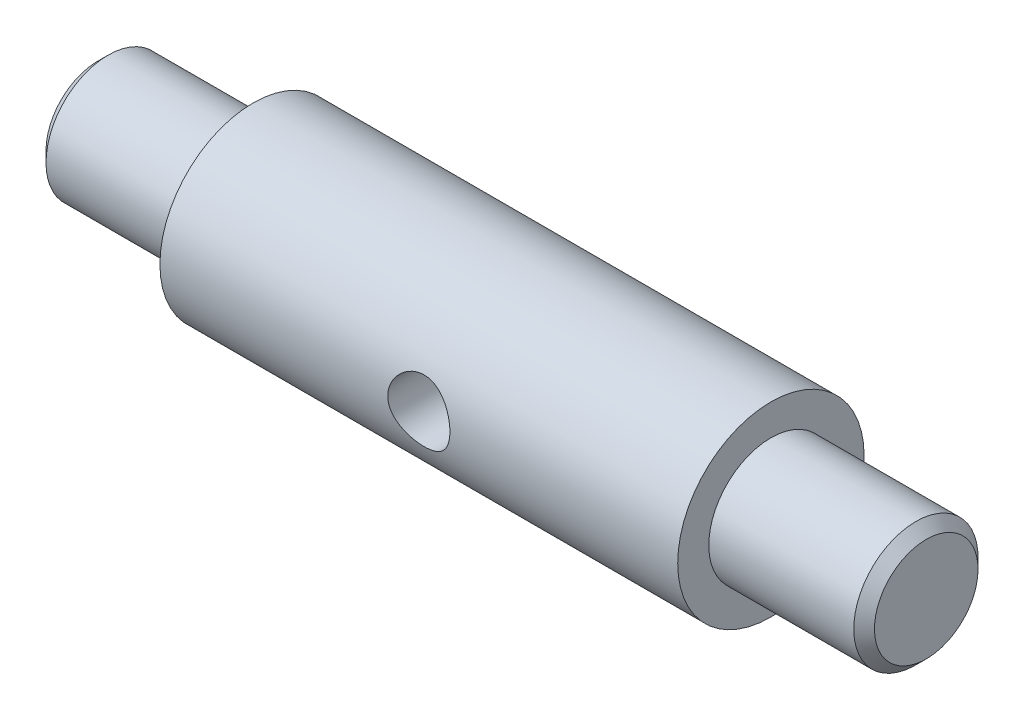
ISO-10303-21;
HEADER;
FILE_DESCRIPTION(('STEP AP214'),'2;1');
FILE_NAME('part.step','',(''),(''),'','','');
FILE_SCHEMA(('AUTOMOTIVE_DESIGN { 1 0 10303 214 1 1 1 1 }'));
ENDSEC;
DATA;
#1=APPLICATION_CONTEXT('core data for automotive mechanical design processes');
#2=APPLICATION_PROTOCOL_DEFINITION('international standard','automotive_design',2000,#1);
#3=PRODUCT_CONTEXT('',#1,'mechanical');
#4=PRODUCT('Part','Part','',(#3));
#5=PRODUCT_RELATED_PRODUCT_CATEGORY('part','',(#4));
#6=PRODUCT_DEFINITION_FORMATION('','',#4);
#7=PRODUCT_DEFINITION_CONTEXT('part definition',#1,'design');
#8=PRODUCT_DEFINITION('design','',#6,#7);
#9=PRODUCT_DEFINITION_SHAPE('','',#8);
#10=(LENGTH_UNIT() NAMED_UNIT(*) SI_UNIT(.MILLI.,.METRE.));
#11=(NAMED_UNIT(*) PLANE_ANGLE_UNIT() SI_UNIT($,.RADIAN.));
#12=(NAMED_UNIT(*) SI_UNIT($,.STERADIAN.) SOLID_ANGLE_UNIT());
#13=UNCERTAINTY_MEASURE_WITH_UNIT(LENGTH_MEASURE(1.E-05),#10,'distance_accuracy_value','');
#14=(GEOMETRIC_REPRESENTATION_CONTEXT(3) GLOBAL_UNCERTAINTY_ASSIGNED_CONTEXT((#13)) GLOBAL_UNIT_ASSIGNED_CONTEXT((#10,
#11,#12)) REPRESENTATION_CONTEXT('',''));
#15=CARTESIAN_POINT('',(0.,0.,0.));
#16=DIRECTION('',(0.,0.,1.));
#17=DIRECTION('',(1.,0.,0.));
#18=AXIS2_PLACEMENT_3D('',#15,#16,#17);
#19=CARTESIAN_POINT('',(40.,0.,-25.));
#20=DIRECTION('',(0.,0.,1.));
#21=DIRECTION('',(1.,0.,0.));
#22=AXIS2_PLACEMENT_3D('',#19,#20,#21);
#23=CYLINDRICAL_SURFACE('',#22,3.);
#24=CARTESIAN_POINT('',(43.,0.,8.99999999999999));
#25=CARTESIAN_POINT('',(43.0000007611949,0.16369008866017,9.00000045902831));
#26=CARTESIAN_POINT('',(42.9865592016184,0.32737558361565,8.99549308522634));
#27=CARTESIAN_POINT('',(42.9333126735484,0.649925282618917,8.97795630609841));
#28=CARTESIAN_POINT('',(42.8935049681532,0.808788984356453,8.96492601606457));
#29=CARTESIAN_POINT('',(42.7890422698479,1.11699836850533,8.93175923719327));
#30=CARTESIAN_POINT('',(42.7244288126222,1.2663594776581,8.91163463192559));
#31=CARTESIAN_POINT('',(42.572376481485,1.55212481041597,8.86633337152024));
#32=CARTESIAN_POINT('',(42.4849331049922,1.68852647087612,8.84115572003333));
#33=CARTESIAN_POINT('',(42.2865225854237,1.9492250250668,8.78742283329014));
#34=CARTESIAN_POINT('',(42.1749062972185,2.07301110089493,8.75878669391354));
#35=CARTESIAN_POINT('',(41.9326985358803,2.30049807810625,8.70180944349364));
#36=CARTESIAN_POINT('',(41.8021028952145,2.40419455646839,8.67346839871646));
#37=CARTESIAN_POINT('',(41.5210446544106,2.59147482668358,8.61939997431821));
#38=CARTESIAN_POINT('',(41.3701187808036,2.67439457466309,8.59377117827064));
#39=CARTESIAN_POINT('',(41.0554717166244,2.81345662163316,8.54925916255803));
#40=CARTESIAN_POINT('',(40.8917544485118,2.8696070921603,8.53037388482236));
#41=CARTESIAN_POINT('',(40.5619803355099,2.95162038452749,8.50233909808131));
#42=CARTESIAN_POINT('',(40.3961883745328,2.97844034481531,8.49288287308833));
#43=CARTESIAN_POINT('',(40.0622087375324,3.00402337000343,8.48386969888522));
#44=CARTESIAN_POINT('',(39.8940218178724,3.00279510481416,8.48430969068189));
#45=CARTESIAN_POINT('',(39.5681901086679,2.97305971111026,8.4947704502454));
#46=CARTESIAN_POINT('',(39.4104147912429,2.94580173950099,8.50435247602598));
#47=CARTESIAN_POINT('',(39.1018197411795,2.86681848854825,8.53129973173652));
#48=CARTESIAN_POINT('',(38.9510008436948,2.81509027977562,8.54866589352322));
#49=CARTESIAN_POINT('',(38.6577617512256,2.68781717418063,8.58953733393745));
#50=CARTESIAN_POINT('',(38.5155159235914,2.61190214612179,8.61313697379351));
#51=CARTESIAN_POINT('',(38.2453872751608,2.43866731890942,8.66377675727179));
#52=CARTESIAN_POINT('',(38.1175086191999,2.34134133709202,8.6908178937139));
#53=CARTESIAN_POINT('',(37.8727252055177,2.12204799804671,8.74701987503222));
#54=CARTESIAN_POINT('',(37.7567419164728,1.99905945022894,8.77621768064528));
#55=CARTESIAN_POINT('',(37.5468062000098,1.73501870991019,8.83220815161109));
#56=CARTESIAN_POINT('',(37.4528558855065,1.59396478698245,8.85900058614201));
#57=CARTESIAN_POINT('',(37.2889110992948,1.29584283913881,8.9075132381338));
#58=CARTESIAN_POINT('',(37.2191635259778,1.13862982924901,8.92918050024117));
#59=CARTESIAN_POINT('',(37.1073904781329,0.813807250093527,8.96461701433304));
#60=CARTESIAN_POINT('',(37.0653553737297,0.646201314464866,8.97838900964637));
#61=CARTESIAN_POINT('',(37.0118330019329,0.313151488587917,8.9960288121432));
#62=CARTESIAN_POINT('',(36.9991005724817,0.147928799594542,9.00030005501183));
#63=CARTESIAN_POINT('',(37.0009980207954,-0.18232520988071,8.99966708084481));
#64=CARTESIAN_POINT('',(37.0156232799396,-0.34735655795895,8.99476441258086));
#65=CARTESIAN_POINT('',(37.0708357232079,-0.667559598912767,8.97660074151312));
#66=CARTESIAN_POINT('',(37.1106586181485,-0.822878420504531,8.96358596133576));
#67=CARTESIAN_POINT('',(37.2141803334002,-1.12456787573872,8.93075540490209));
#68=CARTESIAN_POINT('',(37.2778821984034,-1.27093736552582,8.91093876140024));
#69=CARTESIAN_POINT('',(37.4292112955224,-1.55486488917982,8.86586793861868));
#70=CARTESIAN_POINT('',(37.5174237798495,-1.69208987765144,8.84048444267357));
#71=CARTESIAN_POINT('',(37.7145824500404,-1.95019449040676,8.78715761748787));
#72=CARTESIAN_POINT('',(37.8235349680953,-2.07106910338673,8.75921350781482));
#73=CARTESIAN_POINT('',(38.0649362530198,-2.2987575234189,8.70230543941333));
#74=CARTESIAN_POINT('',(38.1982276807806,-2.40468290773731,8.67335283262283));
#75=CARTESIAN_POINT('',(38.4813147034327,-2.59277256697072,8.61899919884125));
#76=CARTESIAN_POINT('',(38.6311104359022,-2.67493664379304,8.59359820146006));
#77=CARTESIAN_POINT('',(38.9430190458697,-2.81279079124909,8.5494717537415));
#78=CARTESIAN_POINT('',(39.1051062375063,-2.86853439649506,8.53073282378936));
#79=CARTESIAN_POINT('',(39.4371359501324,-2.95168400027807,8.50232496919348));
#80=CARTESIAN_POINT('',(39.607074896213,-2.97910276486182,8.49265195870917));
#81=CARTESIAN_POINT('',(39.9405912881227,-3.00382884743203,8.48393576622531));
#82=CARTESIAN_POINT('',(40.1040470208605,-3.0026107719252,8.48437200772245));
#83=CARTESIAN_POINT('',(40.4282952247662,-2.97372688034608,8.49453809471601));
#84=CARTESIAN_POINT('',(40.5890878538653,-2.94606263837576,8.50426738708084));
#85=CARTESIAN_POINT('',(40.9004069890074,-2.86611543938804,8.53153572914674));
#86=CARTESIAN_POINT('',(41.0510704750135,-2.81431003804654,8.54892294067432));
#87=CARTESIAN_POINT('',(41.3416822208148,-2.68793809727924,8.58949196455405));
#88=CARTESIAN_POINT('',(41.481628093564,-2.61336650566142,8.61267506290178));
#89=CARTESIAN_POINT('',(41.7534510097687,-2.43978207775029,8.66348487678138));
#90=CARTESIAN_POINT('',(41.8847095056952,-2.33984472829374,8.6912613492641));
#91=CARTESIAN_POINT('',(42.1290694401526,-2.11992864940694,8.74750068849758));
#92=CARTESIAN_POINT('',(42.2421657270642,-1.99994425335444,8.77596374737116));
#93=CARTESIAN_POINT('',(42.4514332368675,-1.73772467076206,8.83170091576632));
#94=CARTESIAN_POINT('',(42.546773043253,-1.59480454049919,8.85888545403769));
#95=CARTESIAN_POINT('',(42.7119712865519,-1.29407207221988,8.90777973517835));
#96=CARTESIAN_POINT('',(42.7818362377661,-1.13626355439705,8.92949087723789));
#97=CARTESIAN_POINT('',(42.891164897466,-0.817480941602932,8.96416545205625));
#98=CARTESIAN_POINT('',(42.9318473987901,-0.656963273029229,8.97747637267567));
#99=CARTESIAN_POINT('',(42.9862608420314,-0.330961248030742,8.99539221192664));
#100=CARTESIAN_POINT('',(42.9999992304896,-0.16547827670624,8.99999953595714));
#101=CARTESIAN_POINT('',(43.,0.,8.99999999999999));
#102=B_SPLINE_CURVE_WITH_KNOTS('',3,(#24,#25,#26,#27,#28,#29,#30,#31,#32,#33,#34,#35,#36,#37,
#38,#39,#40,#41,#42,#43,#44,#45,#46,#47,#48,#49,#50,#51,#52,#53,#54,#55,#56,#57,#58,#59,#60,#61,
#62,#63,#64,#65,#66,#67,#68,#69,#70,#71,#72,#73,#74,#75,#76,#77,#78,#79,#80,#81,#82,#83,#84,#85,
#86,#87,#88,#89,#90,#91,#92,#93,#94,#95,#96,#97,#98,#99,#100,#101),.UNSPECIFIED.,.T.,.F.,(4,2,2,
2,2,2,2,2,2,2,2,2,2,2,2,2,2,2,2,2,2,2,2,2,2,2,2,2,2,2,2,2,2,2,2,2,2,2,4),(0.,0.490461318078033,
0.980973555802562,1.47066801861082,1.9604591333973,2.46554052848268,2.97073299862591,
3.49045154470411,4.010011340785,4.51205777225521,5.01394901962457,5.49290479653841,
5.97191792566446,6.45864513465392,6.94551307674622,7.45779917434101,7.97013437899855,
8.48755216951073,9.00479006631625,9.49960749525509,9.9943413949253,10.4747447393464,
10.9552093585231,11.4483119953121,11.9415654246567,12.4572306864226,12.9729002470499,
13.4875204148031,14.0019085411752,14.4898699819277,14.9778023805413,15.4564676124125,
15.9352391452793,16.4349020007541,16.9347063337134,17.453989825053,17.9731404345737,
18.4690967512144,18.9649159811442),.UNSPECIFIED.);
#103=CARTESIAN_POINT('',(43.,0.,8.99999999999999));
#104=VERTEX_POINT('',#103);
#105=EDGE_CURVE('E103',#104,#104,#102,.T.);
#106=ORIENTED_EDGE('',*,*,#105,.T.);
#107=EDGE_LOOP('',(#106));
#108=FACE_BOUND('',#107,.T.);
#109=CARTESIAN_POINT('',(40.,0.,0.));
#110=DIRECTION('',(0.707106781186547,0.,0.707106781186548));
#111=DIRECTION('',(-0.707106781186547,0.,0.707106781186548));
#112=AXIS2_PLACEMENT_3D('',#109,#110,#111);
#113=ELLIPSE('',#112,4.24264068711929,3.);
#114=CARTESIAN_POINT('',(40.,-3.,0.));
#115=VERTEX_POINT('',#114);
#116=CARTESIAN_POINT('',(40.,3.,0.));
#117=VERTEX_POINT('',#116);
#118=EDGE_CURVE('E56',#115,#117,#113,.F.);
#119=ORIENTED_EDGE('',*,*,#118,.T.);
#120=CARTESIAN_POINT('',(40.,0.,0.));
#121=DIRECTION('',(-0.707106781186547,0.,0.707106781186548));
#122=DIRECTION('',(0.707106781186547,0.,0.707106781186548));
#123=AXIS2_PLACEMENT_3D('',#120,#121,#122);
#124=ELLIPSE('',#123,4.24264068711929,3.);
#125=EDGE_CURVE('E11',#117,#115,#124,.F.);
#126=ORIENTED_EDGE('',*,*,#125,.T.);
#127=EDGE_LOOP('',(#119,#126));
#128=FACE_BOUND('',#127,.T.);
#129=ADVANCED_FACE('F41',(#108,#128),#23,.F.);
#130=CARTESIAN_POINT('',(0.,0.,0.));
#131=DIRECTION('',(-1.,0.,0.));
#132=DIRECTION('',(0.,-1.,0.));
#133=AXIS2_PLACEMENT_3D('',#130,#131,#132);
#134=PLANE('',#133);
#135=CARTESIAN_POINT('',(0.,0.,0.));
#136=DIRECTION('',(-1.,0.,0.));
#137=DIRECTION('',(0.,-1.,0.));
#138=AXIS2_PLACEMENT_3D('',#135,#136,#137);
#139=CIRCLE('',#138,3.);
#140=CARTESIAN_POINT('',(0.,-3.,0.));
#141=VERTEX_POINT('',#140);
#142=EDGE_CURVE('E152',#141,#141,#139,.T.);
#143=ORIENTED_EDGE('',*,*,#142,.F.);
#144=EDGE_LOOP('',(#143));
#145=FACE_BOUND('',#144,.T.);
#146=CARTESIAN_POINT('',(0.,0.,0.));
#147=DIRECTION('',(-1.,0.,0.));
#148=DIRECTION('',(0.,-1.,0.));
#149=AXIS2_PLACEMENT_3D('',#146,#147,#148);
#150=CIRCLE('',#149,5.);
#151=CARTESIAN_POINT('',(0.,-5.,0.));
#152=VERTEX_POINT('',#151);
#153=EDGE_CURVE('E84',#152,#152,#150,.T.);
#154=ORIENTED_EDGE('',*,*,#153,.T.);
#155=EDGE_LOOP('',(#154));
#156=FACE_BOUND('',#155,.T.);
#157=ADVANCED_FACE('F137',(#145,#156),#134,.T.);
#158=CARTESIAN_POINT('',(80.,0.,0.));
#159=DIRECTION('',(1.,0.,0.));
#160=DIRECTION('',(0.,1.,0.));
#161=AXIS2_PLACEMENT_3D('',#158,#159,#160);
#162=CYLINDRICAL_SURFACE('',#161,6.);
#163=CARTESIAN_POINT('',(1.,0.,0.));
#164=DIRECTION('',(-1.,0.,0.));
#165=DIRECTION('',(0.,-1.,0.));
#166=AXIS2_PLACEMENT_3D('',#163,#164,#165);
#167=CIRCLE('',#166,6.);
#168=CARTESIAN_POINT('',(1.,-6.,0.));
#169=VERTEX_POINT('',#168);
#170=EDGE_CURVE('E88',#169,#169,#167,.F.);
#171=ORIENTED_EDGE('',*,*,#170,.T.);
#172=EDGE_LOOP('',(#171));
#173=FACE_BOUND('',#172,.T.);
#174=CARTESIAN_POINT('',(15.,0.,0.));
#175=DIRECTION('',(1.,0.,0.));
#176=DIRECTION('',(0.,1.,0.));
#177=AXIS2_PLACEMENT_3D('',#174,#175,#176);
#178=CIRCLE('',#177,6.);
#179=CARTESIAN_POINT('',(15.,6.,0.));
#180=VERTEX_POINT('',#179);
#181=EDGE_CURVE('E92',#180,#180,#178,.T.);
#182=ORIENTED_EDGE('',*,*,#181,.F.);
#183=EDGE_LOOP('',(#182));
#184=FACE_BOUND('',#183,.T.);
#185=ADVANCED_FACE('F142',(#173,#184),#162,.T.);
#186=CARTESIAN_POINT('',(15.,6.,0.));
#187=DIRECTION('',(-1.,0.,0.));
#188=DIRECTION('',(0.,-1.,0.));
#189=AXIS2_PLACEMENT_3D('',#186,#187,#188);
#190=PLANE('',#189);
#191=ORIENTED_EDGE('',*,*,#181,.T.);
#192=EDGE_LOOP('',(#191));
#193=FACE_BOUND('',#192,.T.);
#194=CARTESIAN_POINT('',(15.,0.,0.));
#195=DIRECTION('',(1.,0.,0.));
#196=DIRECTION('',(0.,1.,0.));
#197=AXIS2_PLACEMENT_3D('',#194,#195,#196);
#198=CIRCLE('',#197,8.99999999999999);
#199=CARTESIAN_POINT('',(15.,8.99999999999999,0.));
#200=VERTEX_POINT('',#199);
#201=EDGE_CURVE('E166',#200,#200,#198,.T.);
#202=ORIENTED_EDGE('',*,*,#201,.F.);
#203=EDGE_LOOP('',(#202));
#204=FACE_BOUND('',#203,.T.);
#205=ADVANCED_FACE('F132',(#193,#204),#190,.T.);
#206=CARTESIAN_POINT('',(80.,0.,0.));
#207=DIRECTION('',(1.,0.,0.));
#208=DIRECTION('',(0.,1.,0.));
#209=AXIS2_PLACEMENT_3D('',#206,#207,#208);
#210=CYLINDRICAL_SURFACE('',#209,8.99999999999999);
#211=CARTESIAN_POINT('',(43.,0.,-8.99999999999999));
#212=CARTESIAN_POINT('',(43.0000007611949,-0.16369008866017,-9.00000045902831));
#213=CARTESIAN_POINT('',(42.9865592016184,-0.32737558361565,-8.99549308522634));
#214=CARTESIAN_POINT('',(42.9333126735484,-0.649925282618917,-8.97795630609841));
#215=CARTESIAN_POINT('',(42.8935049681532,-0.808788984356453,-8.96492601606457));
#216=CARTESIAN_POINT('',(42.7890422698479,-1.11699836850533,-8.93175923719327));
#217=CARTESIAN_POINT('',(42.7244288126222,-1.2663594776581,-8.91163463192559));
#218=CARTESIAN_POINT('',(42.572376481485,-1.55212481041597,-8.86633337152024));
#219=CARTESIAN_POINT('',(42.4849331049922,-1.68852647087612,-8.84115572003333));
#220=CARTESIAN_POINT('',(42.2865225854237,-1.9492250250668,-8.78742283329014));
#221=CARTESIAN_POINT('',(42.1749062972185,-2.07301110089493,-8.75878669391354));
#222=CARTESIAN_POINT('',(41.9326985358803,-2.30049807810625,-8.70180944349364));
#223=CARTESIAN_POINT('',(41.8021028952145,-2.40419455646839,-8.67346839871647));
#224=CARTESIAN_POINT('',(41.5210446544106,-2.59147482668358,-8.61939997431821));
#225=CARTESIAN_POINT('',(41.3701187808036,-2.67439457466309,-8.59377117827064));
#226=CARTESIAN_POINT('',(41.0554717166244,-2.81345662163316,-8.54925916255802));
#227=CARTESIAN_POINT('',(40.8917544485118,-2.8696070921603,-8.53037388482236));
#228=CARTESIAN_POINT('',(40.5619803355099,-2.95162038452749,-8.50233909808131));
#229=CARTESIAN_POINT('',(40.3961883745328,-2.97844034481531,-8.49288287308833));
#230=CARTESIAN_POINT('',(40.0622087375324,-3.00402337000343,-8.48386969888522));
#231=CARTESIAN_POINT('',(39.8940218178724,-3.00279510481416,-8.48430969068189));
#232=CARTESIAN_POINT('',(39.5681901086679,-2.97305971111026,-8.4947704502454));
#233=CARTESIAN_POINT('',(39.4104147912429,-2.94580173950099,-8.50435247602598));
#234=CARTESIAN_POINT('',(39.1018197411795,-2.86681848854825,-8.53129973173652));
#235=CARTESIAN_POINT('',(38.9510008436948,-2.81509027977562,-8.54866589352322));
#236=CARTESIAN_POINT('',(38.6577617512256,-2.68781717418063,-8.58953733393745));
#237=CARTESIAN_POINT('',(38.5155159235914,-2.61190214612179,-8.61313697379351));
#238=CARTESIAN_POINT('',(38.2453872751608,-2.43866731890942,-8.66377675727179));
#239=CARTESIAN_POINT('',(38.1175086191999,-2.34134133709202,-8.6908178937139));
#240=CARTESIAN_POINT('',(37.8727252055177,-2.12204799804671,-8.74701987503222));
#241=CARTESIAN_POINT('',(37.7567419164728,-1.99905945022894,-8.77621768064528));
#242=CARTESIAN_POINT('',(37.5468062000098,-1.73501870991019,-8.83220815161109));
#243=CARTESIAN_POINT('',(37.4528558855065,-1.59396478698245,-8.85900058614201));
#244=CARTESIAN_POINT('',(37.2889110992948,-1.29584283913881,-8.9075132381338));
#245=CARTESIAN_POINT('',(37.2191635259778,-1.13862982924901,-8.92918050024117));
#246=CARTESIAN_POINT('',(37.1073904781329,-0.813807250093527,-8.96461701433304));
#247=CARTESIAN_POINT('',(37.0653553737297,-0.646201314464865,-8.97838900964637));
#248=CARTESIAN_POINT('',(37.0118330019329,-0.313151488587915,-8.99602881214321));
#249=CARTESIAN_POINT('',(36.9991005724817,-0.147928799594541,-9.00030005501183));
#250=CARTESIAN_POINT('',(37.0009980207954,0.182325209880711,-8.99966708084481));
#251=CARTESIAN_POINT('',(37.0156232799396,0.34735655795895,-8.99476441258086));
#252=CARTESIAN_POINT('',(37.0708357232079,0.667559598912766,-8.97660074151312));
#253=CARTESIAN_POINT('',(37.1106586181485,0.822878420504529,-8.96358596133576));
#254=CARTESIAN_POINT('',(37.2141803334002,1.12456787573872,-8.93075540490209));
#255=CARTESIAN_POINT('',(37.2778821984034,1.27093736552582,-8.91093876140025));
#256=CARTESIAN_POINT('',(37.4292112955224,1.55486488917982,-8.86586793861869));
#257=CARTESIAN_POINT('',(37.5174237798495,1.69208987765144,-8.84048444267357));
#258=CARTESIAN_POINT('',(37.7145824500404,1.95019449040676,-8.78715761748787));
#259=CARTESIAN_POINT('',(37.8235349680953,2.07106910338673,-8.75921350781482));
#260=CARTESIAN_POINT('',(38.0649362530198,2.2987575234189,-8.70230543941334));
#261=CARTESIAN_POINT('',(38.1982276807806,2.40468290773731,-8.67335283262283));
#262=CARTESIAN_POINT('',(38.4813147034327,2.59277256697072,-8.61899919884125));
#263=CARTESIAN_POINT('',(38.6311104359022,2.67493664379304,-8.59359820146006));
#264=CARTESIAN_POINT('',(38.9430190458697,2.81279079124909,-8.5494717537415));
#265=CARTESIAN_POINT('',(39.1051062375063,2.86853439649506,-8.53073282378936));
#266=CARTESIAN_POINT('',(39.4371359501324,2.95168400027807,-8.50232496919348));
#267=CARTESIAN_POINT('',(39.607074896213,2.97910276486182,-8.49265195870917));
#268=CARTESIAN_POINT('',(39.9405912881227,3.00382884743203,-8.48393576622531));
#269=CARTESIAN_POINT('',(40.1040470208605,3.0026107719252,-8.48437200772245));
#270=CARTESIAN_POINT('',(40.4282952247662,2.97372688034608,-8.49453809471601));
#271=CARTESIAN_POINT('',(40.5890878538653,2.94606263837576,-8.50426738708084));
#272=CARTESIAN_POINT('',(40.9004069890074,2.86611543938804,-8.53153572914674));
#273=CARTESIAN_POINT('',(41.0510704750135,2.81431003804654,-8.54892294067432));
#274=CARTESIAN_POINT('',(41.3416822208148,2.68793809727924,-8.58949196455405));
#275=CARTESIAN_POINT('',(41.481628093564,2.61336650566142,-8.61267506290179));
#276=CARTESIAN_POINT('',(41.7534510097687,2.43978207775029,-8.66348487678138));
#277=CARTESIAN_POINT('',(41.8847095056952,2.33984472829374,-8.6912613492641));
#278=CARTESIAN_POINT('',(42.1290694401526,2.11992864940694,-8.74750068849758));
#279=CARTESIAN_POINT('',(42.2421657270642,1.99994425335444,-8.77596374737116));
#280=CARTESIAN_POINT('',(42.4514332368675,1.73772467076207,-8.83170091576632));
#281=CARTESIAN_POINT('',(42.546773043253,1.59480454049919,-8.85888545403769));
#282=CARTESIAN_POINT('',(42.7119712865519,1.29407207221988,-8.90777973517835));
#283=CARTESIAN_POINT('',(42.7818362377661,1.13626355439705,-8.92949087723789));
#284=CARTESIAN_POINT('',(42.891164897466,0.817480941602931,-8.96416545205625));
#285=CARTESIAN_POINT('',(42.9318473987901,0.656963273029229,-8.97747637267567));
#286=CARTESIAN_POINT('',(42.9862608420314,0.330961248030743,-8.99539221192664));
#287=CARTESIAN_POINT('',(42.9999992304896,0.16547827670624,-8.99999953595714));
#288=CARTESIAN_POINT('',(43.,0.,-8.99999999999999));
#289=B_SPLINE_CURVE_WITH_KNOTS('',3,(#211,#212,#213,#214,#215,#216,#217,#218,#219,#220,#221,
#222,#223,#224,#225,#226,#227,#228,#229,#230,#231,#232,#233,#234,#235,#236,#237,#238,#239,#240,
#241,#242,#243,#244,#245,#246,#247,#248,#249,#250,#251,#252,#253,#254,#255,#256,#257,#258,#259,
#260,#261,#262,#263,#264,#265,#266,#267,#268,#269,#270,#271,#272,#273,#274,#275,#276,#277,#278,
#279,#280,#281,#282,#283,#284,#285,#286,#287,#288),.UNSPECIFIED.,.T.,.F.,(4,2,2,2,2,2,2,2,2,2,2,
2,2,2,2,2,2,2,2,2,2,2,2,2,2,2,2,2,2,2,2,2,2,2,2,2,2,2,4),(0.,0.490461318078033,
0.980973555802562,1.47066801861082,1.9604591333973,2.46554052848268,2.97073299862591,
3.49045154470411,4.010011340785,4.51205777225521,5.01394901962457,5.49290479653841,
5.97191792566446,6.45864513465392,6.94551307674622,7.45779917434101,7.97013437899855,
8.48755216951072,9.00479006631625,9.49960749525509,9.9943413949253,10.4747447393464,
10.9552093585231,11.4483119953121,11.9415654246567,12.4572306864226,12.9729002470499,
13.4875204148031,14.0019085411752,14.4898699819277,14.9778023805413,15.4564676124125,
15.9352391452793,16.4349020007541,16.9347063337134,17.453989825053,17.9731404345737,
18.4690967512144,18.9649159811442),.UNSPECIFIED.);
#290=CARTESIAN_POINT('',(43.,0.,-8.99999999999999));
#291=VERTEX_POINT('',#290);
#292=EDGE_CURVE('E93',#291,#291,#289,.T.);
#293=ORIENTED_EDGE('',*,*,#292,.F.);
#294=EDGE_LOOP('',(#293));
#295=FACE_BOUND('',#294,.T.);
#296=ORIENTED_EDGE('',*,*,#105,.F.);
#297=EDGE_LOOP('',(#296));
#298=FACE_BOUND('',#297,.T.);
#299=ORIENTED_EDGE('',*,*,#201,.T.);
#300=EDGE_LOOP('',(#299));
#301=FACE_BOUND('',#300,.T.);
#302=CARTESIAN_POINT('',(65.,0.,0.));
#303=DIRECTION('',(1.,0.,0.));
#304=DIRECTION('',(0.,1.,0.));
#305=AXIS2_PLACEMENT_3D('',#302,#303,#304);
#306=CIRCLE('',#305,8.99999999999999);
#307=CARTESIAN_POINT('',(65.,8.99999999999999,0.));
#308=VERTEX_POINT('',#307);
#309=EDGE_CURVE('E163',#308,#308,#306,.T.);
#310=ORIENTED_EDGE('',*,*,#309,.F.);
#311=EDGE_LOOP('',(#310));
#312=FACE_BOUND('',#311,.T.);
#313=ADVANCED_FACE('F108',(#295,#298,#301,#312),#210,.T.);
#314=CARTESIAN_POINT('',(65.,8.99999999999999,0.));
#315=DIRECTION('',(1.,0.,0.));
#316=DIRECTION('',(0.,1.,0.));
#317=AXIS2_PLACEMENT_3D('',#314,#315,#316);
#318=PLANE('',#317);
#319=ORIENTED_EDGE('',*,*,#309,.T.);
#320=EDGE_LOOP('',(#319));
#321=FACE_BOUND('',#320,.T.);
#322=CARTESIAN_POINT('',(65.,0.,0.));
#323=DIRECTION('',(1.,0.,0.));
#324=DIRECTION('',(0.,1.,0.));
#325=AXIS2_PLACEMENT_3D('',#322,#323,#324);
#326=CIRCLE('',#325,6.);
#327=CARTESIAN_POINT('',(65.,6.,0.));
#328=VERTEX_POINT('',#327);
#329=EDGE_CURVE('E102',#328,#328,#326,.T.);
#330=ORIENTED_EDGE('',*,*,#329,.F.);
#331=EDGE_LOOP('',(#330));
#332=FACE_BOUND('',#331,.T.);
#333=ADVANCED_FACE('F125',(#321,#332),#318,.T.);
#334=CARTESIAN_POINT('',(80.,0.,0.));
#335=DIRECTION('',(1.,0.,0.));
#336=DIRECTION('',(0.,1.,0.));
#337=AXIS2_PLACEMENT_3D('',#334,#335,#336);
#338=CYLINDRICAL_SURFACE('',#337,6.);
#339=CARTESIAN_POINT('',(79.,0.,0.));
#340=DIRECTION('',(1.,0.,0.));
#341=DIRECTION('',(0.,1.,0.));
#342=AXIS2_PLACEMENT_3D('',#339,#340,#341);
#343=CIRCLE('',#342,6.);
#344=CARTESIAN_POINT('',(79.,6.,0.));
#345=VERTEX_POINT('',#344);
#346=EDGE_CURVE('E71',#345,#345,#343,.F.);
#347=ORIENTED_EDGE('',*,*,#346,.T.);
#348=EDGE_LOOP('',(#347));
#349=FACE_BOUND('',#348,.T.);
#350=ORIENTED_EDGE('',*,*,#329,.T.);
#351=EDGE_LOOP('',(#350));
#352=FACE_BOUND('',#351,.T.);
#353=ADVANCED_FACE('F122',(#349,#352),#338,.T.);
#354=CARTESIAN_POINT('',(80.,6.,0.));
#355=DIRECTION('',(1.,0.,0.));
#356=DIRECTION('',(0.,1.,0.));
#357=AXIS2_PLACEMENT_3D('',#354,#355,#356);
#358=PLANE('',#357);
#359=CARTESIAN_POINT('',(80.,0.,0.));
#360=DIRECTION('',(1.,0.,0.));
#361=DIRECTION('',(0.,1.,0.));
#362=AXIS2_PLACEMENT_3D('',#359,#360,#361);
#363=CIRCLE('',#362,5.);
#364=CARTESIAN_POINT('',(80.,5.00000000000001,0.));
#365=VERTEX_POINT('',#364);
#366=EDGE_CURVE('E80',#365,#365,#363,.T.);
#367=ORIENTED_EDGE('',*,*,#366,.T.);
#368=EDGE_LOOP('',(#367));
#369=FACE_BOUND('',#368,.T.);
#370=ADVANCED_FACE('F117',(#369),#358,.T.);
#371=CARTESIAN_POINT('',(40.,0.,0.));
#372=DIRECTION('',(0.707106781186547,0.,0.707106781186548));
#373=DIRECTION('',(-0.707106781186547,0.,0.707106781186548));
#374=AXIS2_PLACEMENT_3D('',#371,#372,#373);
#375=ELLIPSE('',#374,4.24264068711929,3.);
#376=EDGE_CURVE('E62',#115,#117,#375,.T.);
#377=ORIENTED_EDGE('',*,*,#376,.T.);
#378=CARTESIAN_POINT('',(40.,0.,0.));
#379=DIRECTION('',(-0.707106781186547,0.,0.707106781186548));
#380=DIRECTION('',(0.707106781186547,0.,0.707106781186548));
#381=AXIS2_PLACEMENT_3D('',#378,#379,#380);
#382=ELLIPSE('',#381,4.24264068711929,3.);
#383=EDGE_CURVE('E51',#117,#115,#382,.T.);
#384=ORIENTED_EDGE('',*,*,#383,.T.);
#385=EDGE_LOOP('',(#377,#384));
#386=FACE_BOUND('',#385,.T.);
#387=ORIENTED_EDGE('',*,*,#292,.T.);
#388=EDGE_LOOP('',(#387));
#389=FACE_BOUND('',#388,.T.);
#390=ADVANCED_FACE('F73',(#386,#389),#23,.F.);
#391=CARTESIAN_POINT('',(1.,0.,0.));
#392=DIRECTION('',(1.,0.,0.));
#393=DIRECTION('',(0.,1.,0.));
#394=AXIS2_PLACEMENT_3D('',#391,#392,#393);
#395=CONICAL_SURFACE('',#394,6.,0.785398163397449);
#396=ORIENTED_EDGE('',*,*,#153,.F.);
#397=EDGE_LOOP('',(#396));
#398=FACE_BOUND('',#397,.T.);
#399=ORIENTED_EDGE('',*,*,#170,.F.);
#400=EDGE_LOOP('',(#399));
#401=FACE_BOUND('',#400,.T.);
#402=ADVANCED_FACE('F116',(#398,#401),#395,.T.);
#403=CARTESIAN_POINT('',(80.,0.,0.));
#404=DIRECTION('',(-1.,0.,0.));
#405=DIRECTION('',(0.,-1.,0.));
#406=AXIS2_PLACEMENT_3D('',#403,#404,#405);
#407=CONICAL_SURFACE('',#406,5.,0.785398163397452);
#408=ORIENTED_EDGE('',*,*,#346,.F.);
#409=EDGE_LOOP('',(#408));
#410=FACE_BOUND('',#409,.T.);
#411=ORIENTED_EDGE('',*,*,#366,.F.);
#412=EDGE_LOOP('',(#411));
#413=FACE_BOUND('',#412,.T.);
#414=ADVANCED_FACE('F44',(#410,#413),#407,.T.);
#415=CARTESIAN_POINT('',(45.,0.,0.));
#416=DIRECTION('',(-1.,0.,0.));
#417=DIRECTION('',(0.,-1.,0.));
#418=AXIS2_PLACEMENT_3D('',#415,#416,#417);
#419=CYLINDRICAL_SURFACE('',#418,3.);
#420=ORIENTED_EDGE('',*,*,#142,.T.);
#421=EDGE_LOOP('',(#420));
#422=FACE_BOUND('',#421,.T.);
#423=ORIENTED_EDGE('',*,*,#118,.F.);
#424=ORIENTED_EDGE('',*,*,#383,.F.);
#425=EDGE_LOOP('',(#423,#424));
#426=FACE_BOUND('',#425,.T.);
#427=ADVANCED_FACE('F69',(#422,#426),#419,.F.);
#428=CARTESIAN_POINT('',(45.,0.,0.));
#429=DIRECTION('',(-1.,0.,0.));
#430=DIRECTION('',(0.,-1.,0.));
#431=AXIS2_PLACEMENT_3D('',#428,#429,#430);
#432=CIRCLE('',#431,3.);
#433=CARTESIAN_POINT('',(45.,-3.,0.));
#434=VERTEX_POINT('',#433);
#435=EDGE_CURVE('E149',#434,#434,#432,.T.);
#436=ORIENTED_EDGE('',*,*,#435,.F.);
#437=EDGE_LOOP('',(#436));
#438=FACE_BOUND('',#437,.T.);
#439=ORIENTED_EDGE('',*,*,#376,.F.);
#440=ORIENTED_EDGE('',*,*,#125,.F.);
#441=EDGE_LOOP('',(#439,#440));
#442=FACE_BOUND('',#441,.T.);
#443=ADVANCED_FACE('F63',(#438,#442),#419,.F.);
#444=CARTESIAN_POINT('',(45.,0.,0.));
#445=DIRECTION('',(-1.,0.,0.));
#446=DIRECTION('',(0.,-1.,0.));
#447=AXIS2_PLACEMENT_3D('',#444,#445,#446);
#448=PLANE('',#447);
#449=ORIENTED_EDGE('',*,*,#435,.T.);
#450=EDGE_LOOP('',(#449));
#451=FACE_BOUND('',#450,.T.);
#452=ADVANCED_FACE('F206',(#451),#448,.T.);
#453=CLOSED_SHELL('',(#129,#157,#185,#205,#313,#333,#353,#370,#390,#402,#414,#427,#443,#452));
#454=MANIFOLD_SOLID_BREP('B2',#453);
#455=ADVANCED_BREP_SHAPE_REPRESENTATION('',(#18,#454),#14);
#456=SHAPE_DEFINITION_REPRESENTATION(#9,#455);
ENDSEC;
END-ISO-10303-21;
